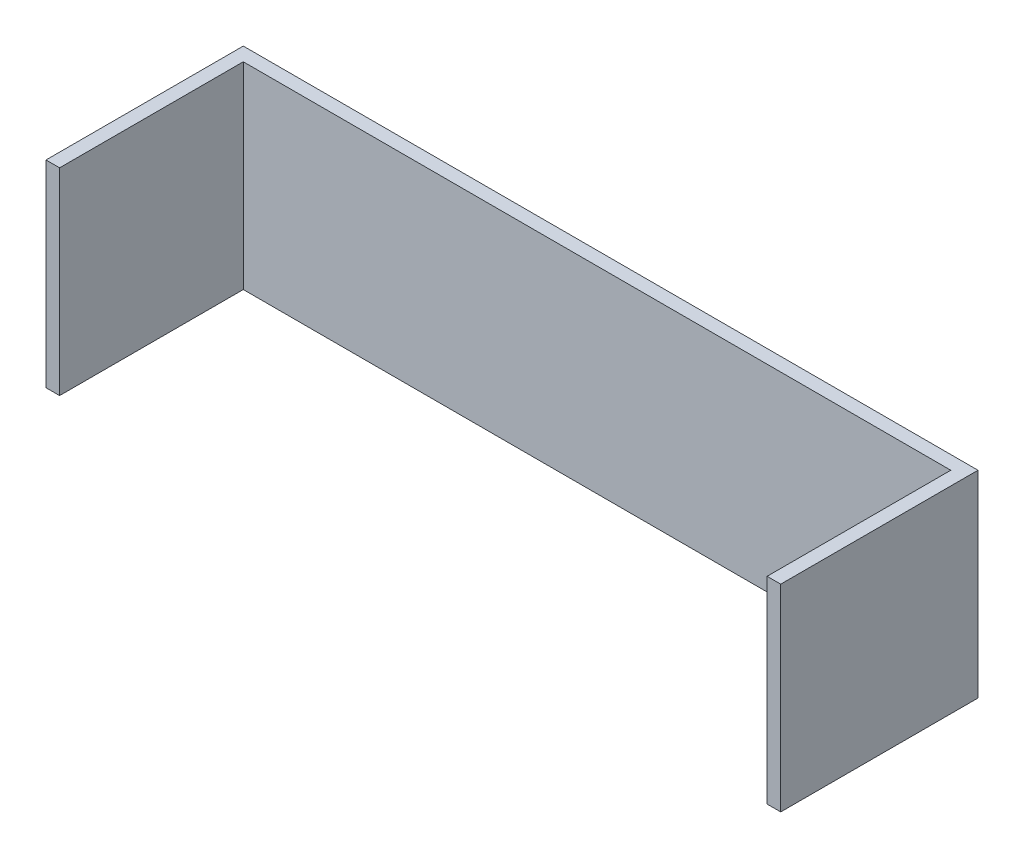
ISO-10303-21;
HEADER;
FILE_DESCRIPTION(('STEP AP214'),'2;1');
FILE_NAME('part.step','',(''),(''),'','','');
FILE_SCHEMA(('AUTOMOTIVE_DESIGN { 1 0 10303 214 1 1 1 1 }'));
ENDSEC;
DATA;
#1=APPLICATION_CONTEXT('core data for automotive mechanical design processes');
#2=APPLICATION_PROTOCOL_DEFINITION('international standard','automotive_design',2000,#1);
#3=PRODUCT_CONTEXT('',#1,'mechanical');
#4=PRODUCT('Part','Part','',(#3));
#5=PRODUCT_RELATED_PRODUCT_CATEGORY('part','',(#4));
#6=PRODUCT_DEFINITION_FORMATION('','',#4);
#7=PRODUCT_DEFINITION_CONTEXT('part definition',#1,'design');
#8=PRODUCT_DEFINITION('design','',#6,#7);
#9=PRODUCT_DEFINITION_SHAPE('','',#8);
#10=(LENGTH_UNIT() NAMED_UNIT(*) SI_UNIT(.MILLI.,.METRE.));
#11=(NAMED_UNIT(*) PLANE_ANGLE_UNIT() SI_UNIT($,.RADIAN.));
#12=(NAMED_UNIT(*) SI_UNIT($,.STERADIAN.) SOLID_ANGLE_UNIT());
#13=UNCERTAINTY_MEASURE_WITH_UNIT(LENGTH_MEASURE(1.E-05),#10,'distance_accuracy_value','');
#14=(GEOMETRIC_REPRESENTATION_CONTEXT(3) GLOBAL_UNCERTAINTY_ASSIGNED_CONTEXT((#13)) GLOBAL_UNIT_ASSIGNED_CONTEXT((#10,
#11,#12)) REPRESENTATION_CONTEXT('',''));
#15=CARTESIAN_POINT('',(0.,0.,0.));
#16=DIRECTION('',(0.,0.,1.));
#17=DIRECTION('',(1.,0.,0.));
#18=AXIS2_PLACEMENT_3D('',#15,#16,#17);
#19=CARTESIAN_POINT('',(0.,145.,145.));
#20=DIRECTION('',(-1.,0.,0.));
#21=DIRECTION('',(0.,0.,1.));
#22=AXIS2_PLACEMENT_3D('',#19,#20,#21);
#23=PLANE('',#22);
#24=DIRECTION('',(0.,0.,-1.));
#25=VECTOR('',#24,1.);
#26=CARTESIAN_POINT('',(0.,0.,145.));
#27=LINE('',#26,#25);
#28=CARTESIAN_POINT('',(0.,0.,145.));
#29=VERTEX_POINT('',#28);
#30=CARTESIAN_POINT('',(0.,0.,0.));
#31=VERTEX_POINT('',#30);
#32=EDGE_CURVE('E129',#29,#31,#27,.T.);
#33=ORIENTED_EDGE('',*,*,#32,.T.);
#34=DIRECTION('',(0.,-1.,0.));
#35=VECTOR('',#34,1.);
#36=CARTESIAN_POINT('',(0.,145.,0.));
#37=LINE('',#36,#35);
#38=CARTESIAN_POINT('',(0.,145.,0.));
#39=VERTEX_POINT('',#38);
#40=EDGE_CURVE('E11',#39,#31,#37,.T.);
#41=ORIENTED_EDGE('',*,*,#40,.F.);
#42=DIRECTION('',(0.,0.,-1.));
#43=VECTOR('',#42,1.);
#44=CARTESIAN_POINT('',(0.,145.,145.));
#45=LINE('',#44,#43);
#46=CARTESIAN_POINT('',(0.,145.,145.));
#47=VERTEX_POINT('',#46);
#48=EDGE_CURVE('E143',#47,#39,#45,.T.);
#49=ORIENTED_EDGE('',*,*,#48,.F.);
#50=DIRECTION('',(0.,-1.,0.));
#51=VECTOR('',#50,1.);
#52=CARTESIAN_POINT('',(0.,145.,145.));
#53=LINE('',#52,#51);
#54=EDGE_CURVE('E125',#47,#29,#53,.T.);
#55=ORIENTED_EDGE('',*,*,#54,.T.);
#56=EDGE_LOOP('',(#33,#41,#49,#55));
#57=FACE_BOUND('',#56,.T.);
#58=ADVANCED_FACE('F33',(#57),#23,.F.);
#59=CARTESIAN_POINT('',(0.,145.,0.));
#60=DIRECTION('',(0.,0.,1.));
#61=DIRECTION('',(1.,0.,0.));
#62=AXIS2_PLACEMENT_3D('',#59,#60,#61);
#63=PLANE('',#62);
#64=DIRECTION('',(-1.,0.,0.));
#65=VECTOR('',#64,1.);
#66=CARTESIAN_POINT('',(0.,0.,0.));
#67=LINE('',#66,#65);
#68=CARTESIAN_POINT('',(-540.,0.,0.));
#69=VERTEX_POINT('',#68);
#70=EDGE_CURVE('E132',#31,#69,#67,.T.);
#71=ORIENTED_EDGE('',*,*,#70,.T.);
#72=DIRECTION('',(0.,-1.,0.));
#73=VECTOR('',#72,1.);
#74=CARTESIAN_POINT('',(-540.,145.,0.));
#75=LINE('',#74,#73);
#76=CARTESIAN_POINT('',(-540.,145.,0.));
#77=VERTEX_POINT('',#76);
#78=EDGE_CURVE('E41',#77,#69,#75,.T.);
#79=ORIENTED_EDGE('',*,*,#78,.F.);
#80=DIRECTION('',(-1.,0.,0.));
#81=VECTOR('',#80,1.);
#82=CARTESIAN_POINT('',(0.,145.,0.));
#83=LINE('',#82,#81);
#84=EDGE_CURVE('E92',#39,#77,#83,.T.);
#85=ORIENTED_EDGE('',*,*,#84,.F.);
#86=ORIENTED_EDGE('',*,*,#40,.T.);
#87=EDGE_LOOP('',(#71,#79,#85,#86));
#88=FACE_BOUND('',#87,.T.);
#89=ADVANCED_FACE('F178',(#88),#63,.F.);
#90=CARTESIAN_POINT('',(-540.,145.,0.));
#91=DIRECTION('',(1.,0.,0.));
#92=DIRECTION('',(0.,0.,-1.));
#93=AXIS2_PLACEMENT_3D('',#90,#91,#92);
#94=PLANE('',#93);
#95=DIRECTION('',(0.,0.,1.));
#96=VECTOR('',#95,1.);
#97=CARTESIAN_POINT('',(-540.,0.,0.));
#98=LINE('',#97,#96);
#99=CARTESIAN_POINT('',(-540.,0.,145.));
#100=VERTEX_POINT('',#99);
#101=EDGE_CURVE('E134',#69,#100,#98,.T.);
#102=ORIENTED_EDGE('',*,*,#101,.T.);
#103=DIRECTION('',(0.,-1.,0.));
#104=VECTOR('',#103,1.);
#105=CARTESIAN_POINT('',(-540.,145.,145.));
#106=LINE('',#105,#104);
#107=CARTESIAN_POINT('',(-540.,145.,145.));
#108=VERTEX_POINT('',#107);
#109=EDGE_CURVE('E150',#108,#100,#106,.T.);
#110=ORIENTED_EDGE('',*,*,#109,.F.);
#111=DIRECTION('',(0.,0.,1.));
#112=VECTOR('',#111,1.);
#113=CARTESIAN_POINT('',(-540.,145.,0.));
#114=LINE('',#113,#112);
#115=EDGE_CURVE('E158',#77,#108,#114,.T.);
#116=ORIENTED_EDGE('',*,*,#115,.F.);
#117=ORIENTED_EDGE('',*,*,#78,.T.);
#118=EDGE_LOOP('',(#102,#110,#116,#117));
#119=FACE_BOUND('',#118,.T.);
#120=ADVANCED_FACE('F156',(#119),#94,.F.);
#121=CARTESIAN_POINT('',(-540.,145.,145.));
#122=DIRECTION('',(0.,0.,-1.));
#123=DIRECTION('',(-1.,0.,0.));
#124=AXIS2_PLACEMENT_3D('',#121,#122,#123);
#125=PLANE('',#124);
#126=DIRECTION('',(1.,0.,0.));
#127=VECTOR('',#126,1.);
#128=CARTESIAN_POINT('',(-540.,0.,145.));
#129=LINE('',#128,#127);
#130=CARTESIAN_POINT('',(-530.,0.,145.));
#131=VERTEX_POINT('',#130);
#132=EDGE_CURVE('E136',#100,#131,#129,.T.);
#133=ORIENTED_EDGE('',*,*,#132,.T.);
#134=DIRECTION('',(0.,-1.,0.));
#135=VECTOR('',#134,1.);
#136=CARTESIAN_POINT('',(-530.,145.,145.));
#137=LINE('',#136,#135);
#138=CARTESIAN_POINT('',(-530.,145.,145.));
#139=VERTEX_POINT('',#138);
#140=EDGE_CURVE('E147',#139,#131,#137,.T.);
#141=ORIENTED_EDGE('',*,*,#140,.F.);
#142=DIRECTION('',(1.,0.,0.));
#143=VECTOR('',#142,1.);
#144=CARTESIAN_POINT('',(-540.,145.,145.));
#145=LINE('',#144,#143);
#146=EDGE_CURVE('E170',#108,#139,#145,.T.);
#147=ORIENTED_EDGE('',*,*,#146,.F.);
#148=ORIENTED_EDGE('',*,*,#109,.T.);
#149=EDGE_LOOP('',(#133,#141,#147,#148));
#150=FACE_BOUND('',#149,.T.);
#151=ADVANCED_FACE('F166',(#150),#125,.F.);
#152=CARTESIAN_POINT('',(-530.,145.,145.));
#153=DIRECTION('',(-1.,0.,0.));
#154=DIRECTION('',(0.,0.,1.));
#155=AXIS2_PLACEMENT_3D('',#152,#153,#154);
#156=PLANE('',#155);
#157=DIRECTION('',(0.,0.,-1.));
#158=VECTOR('',#157,1.);
#159=CARTESIAN_POINT('',(-530.,0.,145.));
#160=LINE('',#159,#158);
#161=CARTESIAN_POINT('',(-530.,0.,10.0000000000001));
#162=VERTEX_POINT('',#161);
#163=EDGE_CURVE('E138',#131,#162,#160,.T.);
#164=ORIENTED_EDGE('',*,*,#163,.T.);
#165=DIRECTION('',(0.,-1.,0.));
#166=VECTOR('',#165,1.);
#167=CARTESIAN_POINT('',(-530.,145.,10.0000000000001));
#168=LINE('',#167,#166);
#169=CARTESIAN_POINT('',(-530.,145.,10.0000000000001));
#170=VERTEX_POINT('',#169);
#171=EDGE_CURVE('E120',#170,#162,#168,.T.);
#172=ORIENTED_EDGE('',*,*,#171,.F.);
#173=DIRECTION('',(0.,0.,-1.));
#174=VECTOR('',#173,1.);
#175=CARTESIAN_POINT('',(-530.,145.,145.));
#176=LINE('',#175,#174);
#177=EDGE_CURVE('E111',#139,#170,#176,.T.);
#178=ORIENTED_EDGE('',*,*,#177,.F.);
#179=ORIENTED_EDGE('',*,*,#140,.T.);
#180=EDGE_LOOP('',(#164,#172,#178,#179));
#181=FACE_BOUND('',#180,.T.);
#182=ADVANCED_FACE('F169',(#181),#156,.F.);
#183=CARTESIAN_POINT('',(-530.,145.,10.0000000000001));
#184=DIRECTION('',(0.,0.,-1.));
#185=DIRECTION('',(-1.,0.,0.));
#186=AXIS2_PLACEMENT_3D('',#183,#184,#185);
#187=PLANE('',#186);
#188=DIRECTION('',(1.,0.,0.));
#189=VECTOR('',#188,1.);
#190=CARTESIAN_POINT('',(-530.,0.,10.0000000000001));
#191=LINE('',#190,#189);
#192=CARTESIAN_POINT('',(-10.,0.,10.0000000000001));
#193=VERTEX_POINT('',#192);
#194=EDGE_CURVE('E119',#162,#193,#191,.T.);
#195=ORIENTED_EDGE('',*,*,#194,.T.);
#196=DIRECTION('',(0.,-1.,0.));
#197=VECTOR('',#196,1.);
#198=CARTESIAN_POINT('',(-10.,145.,10.0000000000001));
#199=LINE('',#198,#197);
#200=CARTESIAN_POINT('',(-10.,145.,10.0000000000001));
#201=VERTEX_POINT('',#200);
#202=EDGE_CURVE('E116',#201,#193,#199,.T.);
#203=ORIENTED_EDGE('',*,*,#202,.F.);
#204=DIRECTION('',(1.,0.,0.));
#205=VECTOR('',#204,1.);
#206=CARTESIAN_POINT('',(-530.,145.,10.0000000000001));
#207=LINE('',#206,#205);
#208=EDGE_CURVE('E105',#170,#201,#207,.T.);
#209=ORIENTED_EDGE('',*,*,#208,.F.);
#210=ORIENTED_EDGE('',*,*,#171,.T.);
#211=EDGE_LOOP('',(#195,#203,#209,#210));
#212=FACE_BOUND('',#211,.T.);
#213=ADVANCED_FACE('F117',(#212),#187,.F.);
#214=CARTESIAN_POINT('',(-10.,145.,10.0000000000001));
#215=DIRECTION('',(1.,0.,0.));
#216=DIRECTION('',(0.,0.,-1.));
#217=AXIS2_PLACEMENT_3D('',#214,#215,#216);
#218=PLANE('',#217);
#219=DIRECTION('',(0.,0.,1.));
#220=VECTOR('',#219,1.);
#221=CARTESIAN_POINT('',(-10.,0.,10.0000000000001));
#222=LINE('',#221,#220);
#223=CARTESIAN_POINT('',(-9.99999999999998,0.,145.));
#224=VERTEX_POINT('',#223);
#225=EDGE_CURVE('E78',#193,#224,#222,.T.);
#226=ORIENTED_EDGE('',*,*,#225,.T.);
#227=DIRECTION('',(0.,-1.,0.));
#228=VECTOR('',#227,1.);
#229=CARTESIAN_POINT('',(-9.99999999999998,145.,145.));
#230=LINE('',#229,#228);
#231=CARTESIAN_POINT('',(-9.99999999999998,145.,145.));
#232=VERTEX_POINT('',#231);
#233=EDGE_CURVE('E121',#232,#224,#230,.T.);
#234=ORIENTED_EDGE('',*,*,#233,.F.);
#235=DIRECTION('',(0.,0.,1.));
#236=VECTOR('',#235,1.);
#237=CARTESIAN_POINT('',(-10.,145.,10.0000000000001));
#238=LINE('',#237,#236);
#239=EDGE_CURVE('E109',#201,#232,#238,.T.);
#240=ORIENTED_EDGE('',*,*,#239,.F.);
#241=ORIENTED_EDGE('',*,*,#202,.T.);
#242=EDGE_LOOP('',(#226,#234,#240,#241));
#243=FACE_BOUND('',#242,.T.);
#244=ADVANCED_FACE('F123',(#243),#218,.F.);
#245=CARTESIAN_POINT('',(-9.99999999999998,145.,145.));
#246=DIRECTION('',(0.,0.,-1.));
#247=DIRECTION('',(-1.,0.,0.));
#248=AXIS2_PLACEMENT_3D('',#245,#246,#247);
#249=PLANE('',#248);
#250=DIRECTION('',(1.,0.,0.));
#251=VECTOR('',#250,1.);
#252=CARTESIAN_POINT('',(-9.99999999999998,0.,145.));
#253=LINE('',#252,#251);
#254=EDGE_CURVE('E84',#224,#29,#253,.T.);
#255=ORIENTED_EDGE('',*,*,#254,.T.);
#256=ORIENTED_EDGE('',*,*,#54,.F.);
#257=DIRECTION('',(1.,0.,0.));
#258=VECTOR('',#257,1.);
#259=CARTESIAN_POINT('',(-9.99999999999998,145.,145.));
#260=LINE('',#259,#258);
#261=EDGE_CURVE('E49',#232,#47,#260,.T.);
#262=ORIENTED_EDGE('',*,*,#261,.F.);
#263=ORIENTED_EDGE('',*,*,#233,.T.);
#264=EDGE_LOOP('',(#255,#256,#262,#263));
#265=FACE_BOUND('',#264,.T.);
#266=ADVANCED_FACE('F194',(#265),#249,.F.);
#267=CARTESIAN_POINT('',(0.,145.,0.));
#268=DIRECTION('',(0.,1.,0.));
#269=DIRECTION('',(0.,0.,1.));
#270=AXIS2_PLACEMENT_3D('',#267,#268,#269);
#271=PLANE('',#270);
#272=ORIENTED_EDGE('',*,*,#48,.T.);
#273=ORIENTED_EDGE('',*,*,#84,.T.);
#274=ORIENTED_EDGE('',*,*,#115,.T.);
#275=ORIENTED_EDGE('',*,*,#146,.T.);
#276=ORIENTED_EDGE('',*,*,#177,.T.);
#277=ORIENTED_EDGE('',*,*,#208,.T.);
#278=ORIENTED_EDGE('',*,*,#239,.T.);
#279=ORIENTED_EDGE('',*,*,#261,.T.);
#280=EDGE_LOOP('',(#272,#273,#274,#275,#276,#277,#278,#279));
#281=FACE_BOUND('',#280,.T.);
#282=ADVANCED_FACE('F107',(#281),#271,.T.);
#283=CARTESIAN_POINT('',(0.,0.,0.));
#284=DIRECTION('',(0.,1.,0.));
#285=DIRECTION('',(0.,0.,1.));
#286=AXIS2_PLACEMENT_3D('',#283,#284,#285);
#287=PLANE('',#286);
#288=ORIENTED_EDGE('',*,*,#32,.F.);
#289=ORIENTED_EDGE('',*,*,#254,.F.);
#290=ORIENTED_EDGE('',*,*,#225,.F.);
#291=ORIENTED_EDGE('',*,*,#194,.F.);
#292=ORIENTED_EDGE('',*,*,#163,.F.);
#293=ORIENTED_EDGE('',*,*,#132,.F.);
#294=ORIENTED_EDGE('',*,*,#101,.F.);
#295=ORIENTED_EDGE('',*,*,#70,.F.);
#296=EDGE_LOOP('',(#288,#289,#290,#291,#292,#293,#294,#295));
#297=FACE_BOUND('',#296,.T.);
#298=ADVANCED_FACE('F162',(#297),#287,.F.);
#299=CLOSED_SHELL('',(#58,#89,#120,#151,#182,#213,#244,#266,#282,#298));
#300=MANIFOLD_SOLID_BREP('B2',#299);
#301=ADVANCED_BREP_SHAPE_REPRESENTATION('',(#18,#300),#14);
#302=SHAPE_DEFINITION_REPRESENTATION(#9,#301);
ENDSEC;
END-ISO-10303-21;
